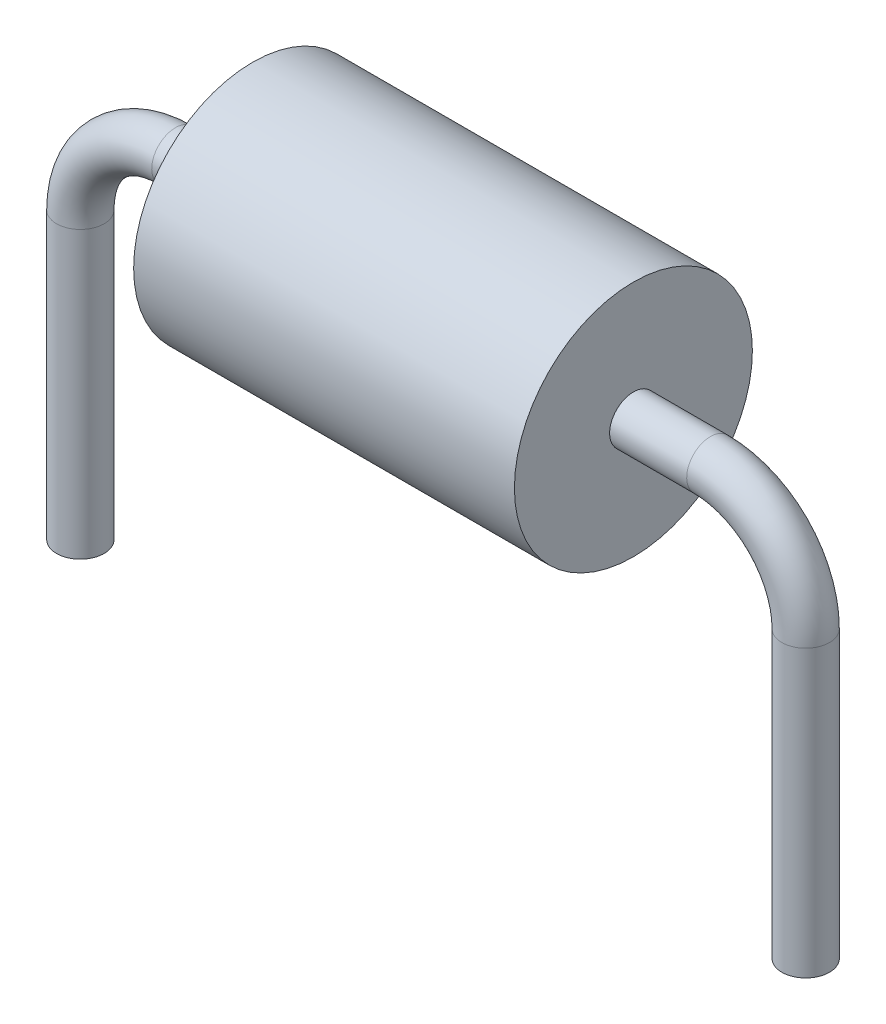
ISO-10303-21;
HEADER;
FILE_DESCRIPTION(('STEP AP214'),'2;1');
FILE_NAME('part.step','',(''),(''),'','','');
FILE_SCHEMA(('AUTOMOTIVE_DESIGN { 1 0 10303 214 1 1 1 1 }'));
ENDSEC;
DATA;
#1=APPLICATION_CONTEXT('core data for automotive mechanical design processes');
#2=APPLICATION_PROTOCOL_DEFINITION('international standard','automotive_design',2000,#1);
#3=PRODUCT_CONTEXT('',#1,'mechanical');
#4=PRODUCT('Part','Part','',(#3));
#5=PRODUCT_RELATED_PRODUCT_CATEGORY('part','',(#4));
#6=PRODUCT_DEFINITION_FORMATION('','',#4);
#7=PRODUCT_DEFINITION_CONTEXT('part definition',#1,'design');
#8=PRODUCT_DEFINITION('design','',#6,#7);
#9=PRODUCT_DEFINITION_SHAPE('','',#8);
#10=(LENGTH_UNIT() NAMED_UNIT(*) SI_UNIT(.MILLI.,.METRE.));
#11=(NAMED_UNIT(*) PLANE_ANGLE_UNIT() SI_UNIT($,.RADIAN.));
#12=(NAMED_UNIT(*) SI_UNIT($,.STERADIAN.) SOLID_ANGLE_UNIT());
#13=UNCERTAINTY_MEASURE_WITH_UNIT(LENGTH_MEASURE(1.E-05),#10,'distance_accuracy_value','');
#14=(GEOMETRIC_REPRESENTATION_CONTEXT(3) GLOBAL_UNCERTAINTY_ASSIGNED_CONTEXT((#13)) GLOBAL_UNIT_ASSIGNED_CONTEXT((#10,
#11,#12)) REPRESENTATION_CONTEXT('',''));
#15=CARTESIAN_POINT('',(0.,0.,0.));
#16=DIRECTION('',(0.,0.,1.));
#17=DIRECTION('',(1.,0.,0.));
#18=AXIS2_PLACEMENT_3D('',#15,#16,#17);
#19=CARTESIAN_POINT('',(0.,0.,0.));
#20=DIRECTION('',(-1.,0.,0.));
#21=DIRECTION('',(0.,0.,1.));
#22=AXIS2_PLACEMENT_3D('',#19,#20,#21);
#23=CYLINDRICAL_SURFACE('',#22,1.25);
#24=CARTESIAN_POINT('',(2.,0.,0.));
#25=DIRECTION('',(-1.,0.,0.));
#26=DIRECTION('',(0.,0.,1.));
#27=AXIS2_PLACEMENT_3D('',#24,#25,#26);
#28=CIRCLE('',#27,1.25);
#29=CARTESIAN_POINT('',(2.,0.,1.25));
#30=VERTEX_POINT('',#29);
#31=EDGE_CURVE('E42',#30,#30,#28,.T.);
#32=ORIENTED_EDGE('',*,*,#31,.T.);
#33=EDGE_LOOP('',(#32));
#34=FACE_BOUND('',#33,.T.);
#35=CARTESIAN_POINT('',(-2.,0.,0.));
#36=DIRECTION('',(-1.,0.,0.));
#37=DIRECTION('',(0.,0.,1.));
#38=AXIS2_PLACEMENT_3D('',#35,#36,#37);
#39=CIRCLE('',#38,1.25);
#40=CARTESIAN_POINT('',(-2.,0.,1.25));
#41=VERTEX_POINT('',#40);
#42=EDGE_CURVE('E62',#41,#41,#39,.T.);
#43=ORIENTED_EDGE('',*,*,#42,.F.);
#44=EDGE_LOOP('',(#43));
#45=FACE_BOUND('',#44,.T.);
#46=ADVANCED_FACE('F39',(#34,#45),#23,.T.);
#47=CARTESIAN_POINT('',(2.,0.,0.));
#48=DIRECTION('',(1.,0.,0.));
#49=DIRECTION('',(0.,0.,-1.));
#50=AXIS2_PLACEMENT_3D('',#47,#48,#49);
#51=PLANE('',#50);
#52=CARTESIAN_POINT('',(2.,0.,0.));
#53=DIRECTION('',(1.,0.,0.));
#54=DIRECTION('',(0.,0.,-1.));
#55=AXIS2_PLACEMENT_3D('',#52,#53,#54);
#56=CIRCLE('',#55,0.25);
#57=CARTESIAN_POINT('',(2.,0.,-0.25));
#58=VERTEX_POINT('',#57);
#59=EDGE_CURVE('E48',#58,#58,#56,.T.);
#60=ORIENTED_EDGE('',*,*,#59,.F.);
#61=EDGE_LOOP('',(#60));
#62=FACE_BOUND('',#61,.T.);
#63=ORIENTED_EDGE('',*,*,#31,.F.);
#64=EDGE_LOOP('',(#63));
#65=FACE_BOUND('',#64,.T.);
#66=ADVANCED_FACE('F91',(#62,#65),#51,.T.);
#67=CARTESIAN_POINT('',(3.81,-4.,0.));
#68=DIRECTION('',(0.,-1.,0.));
#69=DIRECTION('',(0.,0.,-1.));
#70=AXIS2_PLACEMENT_3D('',#67,#68,#69);
#71=PLANE('',#70);
#72=CARTESIAN_POINT('',(3.81,-4.,0.));
#73=DIRECTION('',(0.,-1.,0.));
#74=DIRECTION('',(0.,0.,-1.));
#75=AXIS2_PLACEMENT_3D('',#72,#73,#74);
#76=CIRCLE('',#75,0.25);
#77=CARTESIAN_POINT('',(3.81,-4.,-0.25));
#78=VERTEX_POINT('',#77);
#79=EDGE_CURVE('E54',#78,#78,#76,.T.);
#80=ORIENTED_EDGE('',*,*,#79,.T.);
#81=EDGE_LOOP('',(#80));
#82=FACE_BOUND('',#81,.T.);
#83=ADVANCED_FACE('F93',(#82),#71,.T.);
#84=CARTESIAN_POINT('',(2.,0.,0.));
#85=DIRECTION('',(1.,0.,0.));
#86=DIRECTION('',(0.,0.,-1.));
#87=AXIS2_PLACEMENT_3D('',#84,#85,#86);
#88=CYLINDRICAL_SURFACE('',#87,0.25);
#89=CARTESIAN_POINT('',(2.81,0.,0.));
#90=DIRECTION('',(1.,0.,0.));
#91=DIRECTION('',(0.,0.,-1.));
#92=AXIS2_PLACEMENT_3D('',#89,#90,#91);
#93=CIRCLE('',#92,0.25);
#94=CARTESIAN_POINT('',(2.81,0.25,0.));
#95=VERTEX_POINT('',#94);
#96=EDGE_CURVE('E68',#95,#95,#93,.T.);
#97=ORIENTED_EDGE('',*,*,#96,.F.);
#98=EDGE_LOOP('',(#97));
#99=FACE_BOUND('',#98,.T.);
#100=ORIENTED_EDGE('',*,*,#59,.T.);
#101=EDGE_LOOP('',(#100));
#102=FACE_BOUND('',#101,.T.);
#103=ADVANCED_FACE('F100',(#99,#102),#88,.T.);
#104=CARTESIAN_POINT('',(2.81,-1.,0.));
#105=DIRECTION('',(0.,0.,-1.));
#106=DIRECTION('',(-1.,0.,0.));
#107=AXIS2_PLACEMENT_3D('',#104,#105,#106);
#108=TOROIDAL_SURFACE('',#107,1.,0.25);
#109=CARTESIAN_POINT('',(3.81,-1.,0.));
#110=DIRECTION('',(0.,-1.,0.));
#111=DIRECTION('',(0.,0.,-1.));
#112=AXIS2_PLACEMENT_3D('',#109,#110,#111);
#113=CIRCLE('',#112,0.25);
#114=CARTESIAN_POINT('',(4.06,-1.,0.));
#115=VERTEX_POINT('',#114);
#116=EDGE_CURVE('E81',#115,#115,#113,.T.);
#117=CARTESIAN_POINT('',(2.81,-1.,0.));
#118=DIRECTION('',(0.,0.,-1.));
#119=DIRECTION('',(-1.,0.,0.));
#120=AXIS2_PLACEMENT_3D('',#117,#118,#119);
#121=CIRCLE('',#120,1.25);
#122=EDGE_CURVE('',#95,#115,#121,.T.);
#123=ORIENTED_EDGE('',*,*,#96,.T.);
#124=ORIENTED_EDGE('',*,*,#116,.F.);
#125=ORIENTED_EDGE('',*,*,#122,.T.);
#126=ORIENTED_EDGE('',*,*,#122,.F.);
#127=EDGE_LOOP('',(#123,#125,#124,#126));
#128=FACE_BOUND('',#127,.T.);
#129=ADVANCED_FACE('F105',(#128),#108,.T.);
#130=CARTESIAN_POINT('',(3.81,-1.,0.));
#131=DIRECTION('',(0.,-1.,0.));
#132=DIRECTION('',(1.,0.,0.));
#133=AXIS2_PLACEMENT_3D('',#130,#131,#132);
#134=CYLINDRICAL_SURFACE('',#133,0.25);
#135=ORIENTED_EDGE('',*,*,#79,.F.);
#136=EDGE_LOOP('',(#135));
#137=FACE_BOUND('',#136,.T.);
#138=ORIENTED_EDGE('',*,*,#116,.T.);
#139=EDGE_LOOP('',(#138));
#140=FACE_BOUND('',#139,.T.);
#141=ADVANCED_FACE('F95',(#137,#140),#134,.T.);
#142=CARTESIAN_POINT('',(-2.,0.,0.));
#143=DIRECTION('',(-1.,0.,0.));
#144=DIRECTION('',(0.,0.,-1.));
#145=AXIS2_PLACEMENT_3D('',#142,#143,#144);
#146=PLANE('',#145);
#147=CARTESIAN_POINT('',(-2.,0.,0.));
#148=DIRECTION('',(1.,0.,0.));
#149=DIRECTION('',(0.,0.,-1.));
#150=AXIS2_PLACEMENT_3D('',#147,#148,#149);
#151=CIRCLE('',#150,0.25);
#152=CARTESIAN_POINT('',(-2.,0.,-0.25));
#153=VERTEX_POINT('',#152);
#154=EDGE_CURVE('E11',#153,#153,#151,.F.);
#155=ORIENTED_EDGE('',*,*,#154,.F.);
#156=EDGE_LOOP('',(#155));
#157=FACE_BOUND('',#156,.T.);
#158=ORIENTED_EDGE('',*,*,#42,.T.);
#159=EDGE_LOOP('',(#158));
#160=FACE_BOUND('',#159,.T.);
#161=ADVANCED_FACE('F102',(#157,#160),#146,.T.);
#162=CARTESIAN_POINT('',(-3.81,-4.,0.));
#163=DIRECTION('',(0.,-1.,0.));
#164=DIRECTION('',(0.,0.,-1.));
#165=AXIS2_PLACEMENT_3D('',#162,#163,#164);
#166=PLANE('',#165);
#167=CARTESIAN_POINT('',(-3.81,-4.,0.));
#168=DIRECTION('',(0.,1.,0.));
#169=DIRECTION('',(0.,0.,-1.));
#170=AXIS2_PLACEMENT_3D('',#167,#168,#169);
#171=CIRCLE('',#170,0.25);
#172=CARTESIAN_POINT('',(-3.81,-4.,-0.25));
#173=VERTEX_POINT('',#172);
#174=EDGE_CURVE('E58',#173,#173,#171,.F.);
#175=ORIENTED_EDGE('',*,*,#174,.T.);
#176=EDGE_LOOP('',(#175));
#177=FACE_BOUND('',#176,.T.);
#178=ADVANCED_FACE('F59',(#177),#166,.T.);
#179=CARTESIAN_POINT('',(-2.,0.,0.));
#180=DIRECTION('',(-1.,0.,0.));
#181=DIRECTION('',(0.,0.,1.));
#182=AXIS2_PLACEMENT_3D('',#179,#180,#181);
#183=CYLINDRICAL_SURFACE('',#182,0.25);
#184=CARTESIAN_POINT('',(-2.81,0.,0.));
#185=DIRECTION('',(1.,0.,0.));
#186=DIRECTION('',(0.,0.,-1.));
#187=AXIS2_PLACEMENT_3D('',#184,#185,#186);
#188=CIRCLE('',#187,0.25);
#189=CARTESIAN_POINT('',(-2.81,0.25,0.));
#190=VERTEX_POINT('',#189);
#191=EDGE_CURVE('E71',#190,#190,#188,.F.);
#192=ORIENTED_EDGE('',*,*,#191,.F.);
#193=EDGE_LOOP('',(#192));
#194=FACE_BOUND('',#193,.T.);
#195=ORIENTED_EDGE('',*,*,#154,.T.);
#196=EDGE_LOOP('',(#195));
#197=FACE_BOUND('',#196,.T.);
#198=ADVANCED_FACE('F124',(#194,#197),#183,.T.);
#199=CARTESIAN_POINT('',(-2.81,-1.,0.));
#200=DIRECTION('',(0.,0.,1.));
#201=DIRECTION('',(1.,0.,0.));
#202=AXIS2_PLACEMENT_3D('',#199,#200,#201);
#203=TOROIDAL_SURFACE('',#202,1.,0.25);
#204=CARTESIAN_POINT('',(-3.81,-1.,0.));
#205=DIRECTION('',(0.,1.,0.));
#206=DIRECTION('',(0.,0.,-1.));
#207=AXIS2_PLACEMENT_3D('',#204,#205,#206);
#208=CIRCLE('',#207,0.25);
#209=CARTESIAN_POINT('',(-4.06,-1.,0.));
#210=VERTEX_POINT('',#209);
#211=EDGE_CURVE('E63',#210,#210,#208,.F.);
#212=CARTESIAN_POINT('',(-2.81,-1.,0.));
#213=DIRECTION('',(0.,0.,1.));
#214=DIRECTION('',(1.,0.,0.));
#215=AXIS2_PLACEMENT_3D('',#212,#213,#214);
#216=CIRCLE('',#215,1.25);
#217=EDGE_CURVE('',#190,#210,#216,.T.);
#218=ORIENTED_EDGE('',*,*,#191,.T.);
#219=ORIENTED_EDGE('',*,*,#211,.F.);
#220=ORIENTED_EDGE('',*,*,#217,.T.);
#221=ORIENTED_EDGE('',*,*,#217,.F.);
#222=EDGE_LOOP('',(#218,#220,#219,#221));
#223=FACE_BOUND('',#222,.T.);
#224=ADVANCED_FACE('F127',(#223),#203,.T.);
#225=CARTESIAN_POINT('',(-3.81,-1.,0.));
#226=DIRECTION('',(0.,-1.,0.));
#227=DIRECTION('',(1.,0.,0.));
#228=AXIS2_PLACEMENT_3D('',#225,#226,#227);
#229=CYLINDRICAL_SURFACE('',#228,0.25);
#230=ORIENTED_EDGE('',*,*,#174,.F.);
#231=EDGE_LOOP('',(#230));
#232=FACE_BOUND('',#231,.T.);
#233=ORIENTED_EDGE('',*,*,#211,.T.);
#234=EDGE_LOOP('',(#233));
#235=FACE_BOUND('',#234,.T.);
#236=ADVANCED_FACE('F114',(#232,#235),#229,.T.);
#237=CLOSED_SHELL('',(#46,#66,#83,#103,#129,#141,#161,#178,#198,#224,#236));
#238=MANIFOLD_SOLID_BREP('B2',#237);
#239=ADVANCED_BREP_SHAPE_REPRESENTATION('',(#18,#238),#14);
#240=SHAPE_DEFINITION_REPRESENTATION(#9,#239);
ENDSEC;
END-ISO-10303-21;
